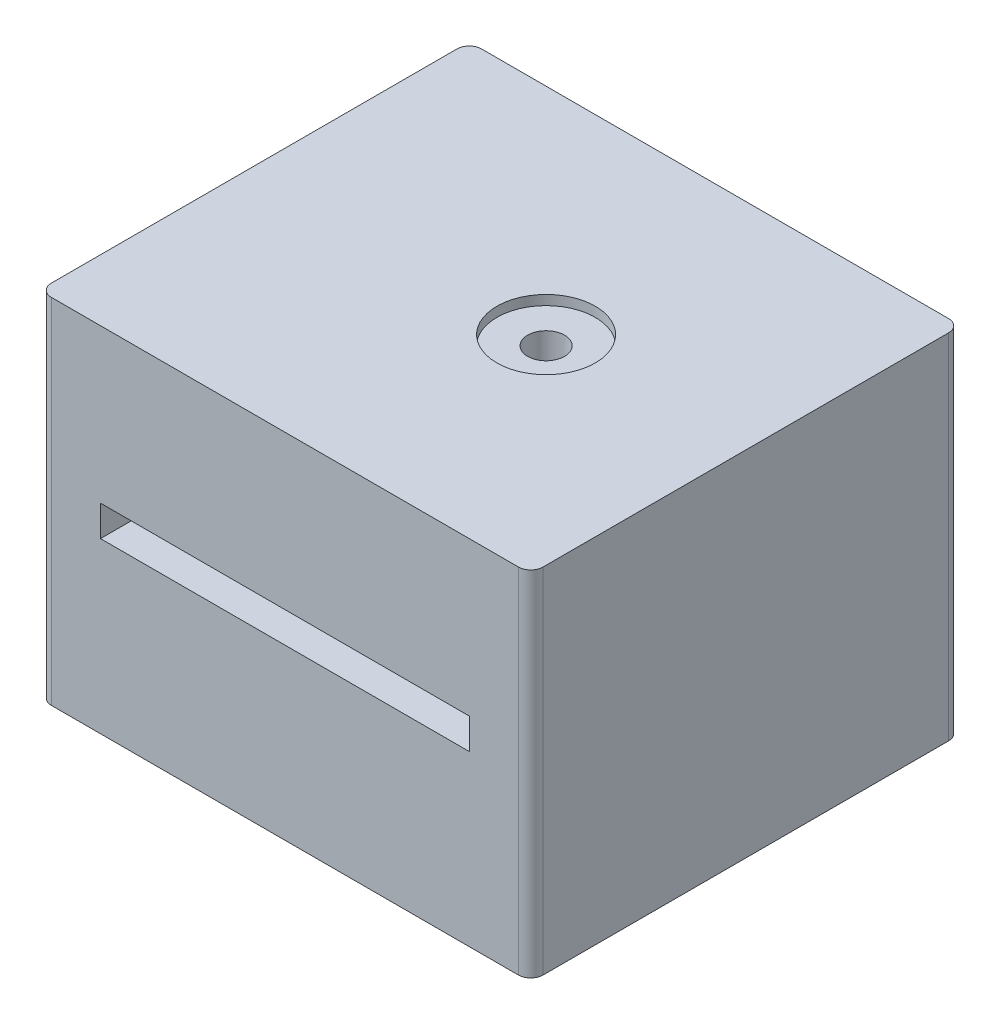
ISO-10303-21;
HEADER;
FILE_DESCRIPTION(('STEP AP214'),'2;1');
FILE_NAME('part.step','',(''),(''),'','','');
FILE_SCHEMA(('AUTOMOTIVE_DESIGN { 1 0 10303 214 1 1 1 1 }'));
ENDSEC;
DATA;
#1=APPLICATION_CONTEXT('core data for automotive mechanical design processes');
#2=APPLICATION_PROTOCOL_DEFINITION('international standard','automotive_design',2000,#1);
#3=PRODUCT_CONTEXT('',#1,'mechanical');
#4=PRODUCT('Part','Part','',(#3));
#5=PRODUCT_RELATED_PRODUCT_CATEGORY('part','',(#4));
#6=PRODUCT_DEFINITION_FORMATION('','',#4);
#7=PRODUCT_DEFINITION_CONTEXT('part definition',#1,'design');
#8=PRODUCT_DEFINITION('design','',#6,#7);
#9=PRODUCT_DEFINITION_SHAPE('','',#8);
#10=(LENGTH_UNIT() NAMED_UNIT(*) SI_UNIT(.MILLI.,.METRE.));
#11=(NAMED_UNIT(*) PLANE_ANGLE_UNIT() SI_UNIT($,.RADIAN.));
#12=(NAMED_UNIT(*) SI_UNIT($,.STERADIAN.) SOLID_ANGLE_UNIT());
#13=UNCERTAINTY_MEASURE_WITH_UNIT(LENGTH_MEASURE(1.E-05),#10,'distance_accuracy_value','');
#14=(GEOMETRIC_REPRESENTATION_CONTEXT(3) GLOBAL_UNCERTAINTY_ASSIGNED_CONTEXT((#13)) GLOBAL_UNIT_ASSIGNED_CONTEXT((#10,
#11,#12)) REPRESENTATION_CONTEXT('',''));
#15=CARTESIAN_POINT('',(0.,0.,0.));
#16=DIRECTION('',(0.,0.,1.));
#17=DIRECTION('',(1.,0.,0.));
#18=AXIS2_PLACEMENT_3D('',#15,#16,#17);
#19=CARTESIAN_POINT('',(-60.,40.,50.));
#20=DIRECTION('',(0.,0.,1.));
#21=DIRECTION('',(1.,0.,0.));
#22=AXIS2_PLACEMENT_3D('',#19,#20,#21);
#23=PLANE('',#22);
#24=DIRECTION('',(0.,1.,0.));
#25=VECTOR('',#24,1.);
#26=CARTESIAN_POINT('',(60.,40.,50.));
#27=LINE('',#26,#25);
#28=CARTESIAN_POINT('',(60.,50.,50.));
#29=VERTEX_POINT('',#28);
#30=CARTESIAN_POINT('',(60.,80.,50.));
#31=VERTEX_POINT('',#30);
#32=EDGE_CURVE('E147',#29,#31,#27,.T.);
#33=ORIENTED_EDGE('',*,*,#32,.F.);
#34=DIRECTION('',(-1.,0.,0.));
#35=VECTOR('',#34,1.);
#36=CARTESIAN_POINT('',(-60.,50.0000000000001,50.));
#37=LINE('',#36,#35);
#38=CARTESIAN_POINT('',(-60.,50.0000000000001,50.));
#39=VERTEX_POINT('',#38);
#40=EDGE_CURVE('E155',#29,#39,#37,.T.);
#41=ORIENTED_EDGE('',*,*,#40,.T.);
#42=DIRECTION('',(0.,1.,0.));
#43=VECTOR('',#42,1.);
#44=CARTESIAN_POINT('',(-60.,40.,50.));
#45=LINE('',#44,#43);
#46=CARTESIAN_POINT('',(-60.,80.,50.));
#47=VERTEX_POINT('',#46);
#48=EDGE_CURVE('E180',#39,#47,#45,.T.);
#49=ORIENTED_EDGE('',*,*,#48,.T.);
#50=DIRECTION('',(1.,0.,0.));
#51=VECTOR('',#50,1.);
#52=CARTESIAN_POINT('',(-60.,80.,50.));
#53=LINE('',#52,#51);
#54=EDGE_CURVE('E165',#47,#31,#53,.T.);
#55=ORIENTED_EDGE('',*,*,#54,.T.);
#56=EDGE_LOOP('',(#33,#41,#49,#55));
#57=FACE_BOUND('',#56,.T.);
#58=ADVANCED_FACE('F41',(#57),#23,.F.);
#59=CARTESIAN_POINT('',(-60.,40.,-50.));
#60=DIRECTION('',(-1.,0.,0.));
#61=DIRECTION('',(0.,0.,1.));
#62=AXIS2_PLACEMENT_3D('',#59,#60,#61);
#63=PLANE('',#62);
#64=DIRECTION('',(0.,0.,1.));
#65=VECTOR('',#64,1.);
#66=CARTESIAN_POINT('',(-60.,80.,-50.));
#67=LINE('',#66,#65);
#68=CARTESIAN_POINT('',(-60.,80.,-50.));
#69=VERTEX_POINT('',#68);
#70=EDGE_CURVE('E362',#69,#47,#67,.T.);
#71=ORIENTED_EDGE('',*,*,#70,.T.);
#72=ORIENTED_EDGE('',*,*,#48,.F.);
#73=DIRECTION('',(0.,0.,1.));
#74=VECTOR('',#73,1.);
#75=CARTESIAN_POINT('',(-60.,50.0000000000001,50.));
#76=LINE('',#75,#74);
#77=CARTESIAN_POINT('',(-60.,50.0000000000001,70.));
#78=VERTEX_POINT('',#77);
#79=EDGE_CURVE('E154',#39,#78,#76,.T.);
#80=ORIENTED_EDGE('',*,*,#79,.T.);
#81=DIRECTION('',(0.,-1.,0.));
#82=VECTOR('',#81,1.);
#83=CARTESIAN_POINT('',(-60.,50.0000000000001,70.));
#84=LINE('',#83,#82);
#85=CARTESIAN_POINT('',(-60.,40.,70.));
#86=VERTEX_POINT('',#85);
#87=EDGE_CURVE('E374',#78,#86,#84,.T.);
#88=ORIENTED_EDGE('',*,*,#87,.T.);
#89=DIRECTION('',(0.,0.,1.));
#90=VECTOR('',#89,1.);
#91=CARTESIAN_POINT('',(-60.,40.,-50.));
#92=LINE('',#91,#90);
#93=CARTESIAN_POINT('',(-60.,40.,-50.));
#94=VERTEX_POINT('',#93);
#95=EDGE_CURVE('E167',#94,#86,#92,.T.);
#96=ORIENTED_EDGE('',*,*,#95,.F.);
#97=DIRECTION('',(0.,1.,0.));
#98=VECTOR('',#97,1.);
#99=CARTESIAN_POINT('',(-60.,40.,-50.));
#100=LINE('',#99,#98);
#101=EDGE_CURVE('E170',#94,#69,#100,.T.);
#102=ORIENTED_EDGE('',*,*,#101,.T.);
#103=EDGE_LOOP('',(#71,#72,#80,#88,#96,#102));
#104=FACE_BOUND('',#103,.T.);
#105=ADVANCED_FACE('F278',(#104),#63,.F.);
#106=CARTESIAN_POINT('',(-60.,40.,-50.));
#107=DIRECTION('',(0.,0.,1.));
#108=DIRECTION('',(1.,0.,0.));
#109=AXIS2_PLACEMENT_3D('',#106,#107,#108);
#110=PLANE('',#109);
#111=DIRECTION('',(1.,0.,0.));
#112=VECTOR('',#111,1.);
#113=CARTESIAN_POINT('',(-60.,80.,-50.));
#114=LINE('',#113,#112);
#115=CARTESIAN_POINT('',(60.,80.,-50.));
#116=VERTEX_POINT('',#115);
#117=EDGE_CURVE('E357',#69,#116,#114,.T.);
#118=ORIENTED_EDGE('',*,*,#117,.F.);
#119=ORIENTED_EDGE('',*,*,#101,.F.);
#120=DIRECTION('',(1.,0.,0.));
#121=VECTOR('',#120,1.);
#122=CARTESIAN_POINT('',(-60.,40.,-50.));
#123=LINE('',#122,#121);
#124=CARTESIAN_POINT('',(60.,40.,-50.));
#125=VERTEX_POINT('',#124);
#126=EDGE_CURVE('E172',#94,#125,#123,.T.);
#127=ORIENTED_EDGE('',*,*,#126,.T.);
#128=DIRECTION('',(0.,1.,0.));
#129=VECTOR('',#128,1.);
#130=CARTESIAN_POINT('',(60.,40.,-50.));
#131=LINE('',#130,#129);
#132=EDGE_CURVE('E166',#125,#116,#131,.T.);
#133=ORIENTED_EDGE('',*,*,#132,.T.);
#134=EDGE_LOOP('',(#118,#119,#127,#133));
#135=FACE_BOUND('',#134,.T.);
#136=ADVANCED_FACE('F283',(#135),#110,.T.);
#137=CARTESIAN_POINT('',(60.,40.,-50.));
#138=DIRECTION('',(-1.,0.,0.));
#139=DIRECTION('',(0.,0.,1.));
#140=AXIS2_PLACEMENT_3D('',#137,#138,#139);
#141=PLANE('',#140);
#142=DIRECTION('',(0.,0.,1.));
#143=VECTOR('',#142,1.);
#144=CARTESIAN_POINT('',(60.,80.,-50.));
#145=LINE('',#144,#143);
#146=EDGE_CURVE('E363',#116,#31,#145,.T.);
#147=ORIENTED_EDGE('',*,*,#146,.F.);
#148=ORIENTED_EDGE('',*,*,#132,.F.);
#149=DIRECTION('',(0.,0.,1.));
#150=VECTOR('',#149,1.);
#151=CARTESIAN_POINT('',(60.,40.,-50.));
#152=LINE('',#151,#150);
#153=CARTESIAN_POINT('',(60.,40.,70.));
#154=VERTEX_POINT('',#153);
#155=EDGE_CURVE('E366',#125,#154,#152,.T.);
#156=ORIENTED_EDGE('',*,*,#155,.T.);
#157=DIRECTION('',(0.,1.,0.));
#158=VECTOR('',#157,1.);
#159=CARTESIAN_POINT('',(60.,50.,70.));
#160=LINE('',#159,#158);
#161=CARTESIAN_POINT('',(60.,50.,70.));
#162=VERTEX_POINT('',#161);
#163=EDGE_CURVE('E150',#154,#162,#160,.T.);
#164=ORIENTED_EDGE('',*,*,#163,.T.);
#165=DIRECTION('',(0.,0.,1.));
#166=VECTOR('',#165,1.);
#167=CARTESIAN_POINT('',(60.,50.,50.));
#168=LINE('',#167,#166);
#169=EDGE_CURVE('E142',#29,#162,#168,.T.);
#170=ORIENTED_EDGE('',*,*,#169,.F.);
#171=ORIENTED_EDGE('',*,*,#32,.T.);
#172=EDGE_LOOP('',(#147,#148,#156,#164,#170,#171));
#173=FACE_BOUND('',#172,.T.);
#174=ADVANCED_FACE('F145',(#173),#141,.T.);
#175=CARTESIAN_POINT('',(0.,40.,0.));
#176=DIRECTION('',(0.,-1.,0.));
#177=DIRECTION('',(0.,0.,-1.));
#178=AXIS2_PLACEMENT_3D('',#175,#176,#177);
#179=PLANE('',#178);
#180=CARTESIAN_POINT('',(-15.,40.,0.));
#181=DIRECTION('',(0.,1.,0.));
#182=DIRECTION('',(0.,0.,1.));
#183=AXIS2_PLACEMENT_3D('',#180,#181,#182);
#184=CIRCLE('',#183,16.);
#185=CARTESIAN_POINT('',(-15.,40.,16.));
#186=VERTEX_POINT('',#185);
#187=EDGE_CURVE('E395',#186,#186,#184,.T.);
#188=ORIENTED_EDGE('',*,*,#187,.F.);
#189=EDGE_LOOP('',(#188));
#190=FACE_BOUND('',#189,.T.);
#191=CARTESIAN_POINT('',(15.,40.,0.));
#192=DIRECTION('',(0.,1.,0.));
#193=DIRECTION('',(0.,0.,1.));
#194=AXIS2_PLACEMENT_3D('',#191,#192,#193);
#195=CIRCLE('',#194,8.);
#196=CARTESIAN_POINT('',(15.,40.,8.));
#197=VERTEX_POINT('',#196);
#198=EDGE_CURVE('E389',#197,#197,#195,.T.);
#199=ORIENTED_EDGE('',*,*,#198,.F.);
#200=EDGE_LOOP('',(#199));
#201=FACE_BOUND('',#200,.T.);
#202=ORIENTED_EDGE('',*,*,#95,.T.);
#203=DIRECTION('',(1.,0.,0.));
#204=VECTOR('',#203,1.);
#205=CARTESIAN_POINT('',(-60.,40.,70.));
#206=LINE('',#205,#204);
#207=EDGE_CURVE('E379',#86,#154,#206,.T.);
#208=ORIENTED_EDGE('',*,*,#207,.T.);
#209=ORIENTED_EDGE('',*,*,#155,.F.);
#210=ORIENTED_EDGE('',*,*,#126,.F.);
#211=EDGE_LOOP('',(#202,#208,#209,#210));
#212=FACE_BOUND('',#211,.T.);
#213=ADVANCED_FACE('F345',(#190,#201,#212),#179,.F.);
#214=CARTESIAN_POINT('',(0.,80.,0.));
#215=DIRECTION('',(0.,-1.,0.));
#216=DIRECTION('',(0.,0.,-1.));
#217=AXIS2_PLACEMENT_3D('',#214,#215,#216);
#218=PLANE('',#217);
#219=CARTESIAN_POINT('',(-15.,80.,0.));
#220=DIRECTION('',(0.,1.,0.));
#221=DIRECTION('',(0.,0.,1.));
#222=AXIS2_PLACEMENT_3D('',#219,#220,#221);
#223=CIRCLE('',#222,8.);
#224=CARTESIAN_POINT('',(-15.,80.,8.));
#225=VERTEX_POINT('',#224);
#226=EDGE_CURVE('E417',#225,#225,#223,.T.);
#227=ORIENTED_EDGE('',*,*,#226,.T.);
#228=EDGE_LOOP('',(#227));
#229=FACE_BOUND('',#228,.T.);
#230=CARTESIAN_POINT('',(15.,80.,0.));
#231=DIRECTION('',(0.,-1.,0.));
#232=DIRECTION('',(0.,0.,-1.));
#233=AXIS2_PLACEMENT_3D('',#230,#231,#232);
#234=CIRCLE('',#233,6.);
#235=CARTESIAN_POINT('',(15.,80.,6.));
#236=VERTEX_POINT('',#235);
#237=EDGE_CURVE('E414',#236,#236,#234,.F.);
#238=ORIENTED_EDGE('',*,*,#237,.T.);
#239=EDGE_LOOP('',(#238));
#240=FACE_BOUND('',#239,.T.);
#241=ORIENTED_EDGE('',*,*,#54,.F.);
#242=ORIENTED_EDGE('',*,*,#70,.F.);
#243=ORIENTED_EDGE('',*,*,#117,.T.);
#244=ORIENTED_EDGE('',*,*,#146,.T.);
#245=EDGE_LOOP('',(#241,#242,#243,#244));
#246=FACE_BOUND('',#245,.T.);
#247=ADVANCED_FACE('F330',(#229,#240,#246),#218,.T.);
#248=CARTESIAN_POINT('',(15.,30.,0.));
#249=DIRECTION('',(0.,1.,0.));
#250=DIRECTION('',(0.,0.,1.));
#251=AXIS2_PLACEMENT_3D('',#248,#249,#250);
#252=PLANE('',#251);
#253=CARTESIAN_POINT('',(15.,30.,0.));
#254=DIRECTION('',(0.,1.,0.));
#255=DIRECTION('',(0.,0.,1.));
#256=AXIS2_PLACEMENT_3D('',#253,#254,#255);
#257=CIRCLE('',#256,8.);
#258=CARTESIAN_POINT('',(15.,30.,8.));
#259=VERTEX_POINT('',#258);
#260=EDGE_CURVE('E392',#259,#259,#257,.T.);
#261=ORIENTED_EDGE('',*,*,#260,.T.);
#262=EDGE_LOOP('',(#261));
#263=FACE_BOUND('',#262,.T.);
#264=CARTESIAN_POINT('',(15.,30.,0.));
#265=DIRECTION('',(0.,1.,0.));
#266=DIRECTION('',(0.,0.,1.));
#267=AXIS2_PLACEMENT_3D('',#264,#265,#266);
#268=CIRCLE('',#267,6.);
#269=CARTESIAN_POINT('',(15.,30.,6.));
#270=VERTEX_POINT('',#269);
#271=EDGE_CURVE('E201',#270,#270,#268,.F.);
#272=ORIENTED_EDGE('',*,*,#271,.T.);
#273=EDGE_LOOP('',(#272));
#274=FACE_BOUND('',#273,.T.);
#275=ADVANCED_FACE('F327',(#263,#274),#252,.T.);
#276=CARTESIAN_POINT('',(15.,30.,0.));
#277=DIRECTION('',(0.,1.,0.));
#278=DIRECTION('',(0.,0.,1.));
#279=AXIS2_PLACEMENT_3D('',#276,#277,#278);
#280=CYLINDRICAL_SURFACE('',#279,8.);
#281=ORIENTED_EDGE('',*,*,#260,.F.);
#282=EDGE_LOOP('',(#281));
#283=FACE_BOUND('',#282,.T.);
#284=ORIENTED_EDGE('',*,*,#198,.T.);
#285=EDGE_LOOP('',(#284));
#286=FACE_BOUND('',#285,.T.);
#287=ADVANCED_FACE('F321',(#283,#286),#280,.F.);
#288=CARTESIAN_POINT('',(-15.,30.,0.));
#289=DIRECTION('',(0.,1.,0.));
#290=DIRECTION('',(0.,0.,1.));
#291=AXIS2_PLACEMENT_3D('',#288,#289,#290);
#292=PLANE('',#291);
#293=CARTESIAN_POINT('',(-15.,30.,0.));
#294=DIRECTION('',(0.,1.,0.));
#295=DIRECTION('',(0.,0.,1.));
#296=AXIS2_PLACEMENT_3D('',#293,#294,#295);
#297=CIRCLE('',#296,16.);
#298=CARTESIAN_POINT('',(-15.,30.,16.));
#299=VERTEX_POINT('',#298);
#300=EDGE_CURVE('E205',#299,#299,#297,.T.);
#301=ORIENTED_EDGE('',*,*,#300,.T.);
#302=EDGE_LOOP('',(#301));
#303=FACE_BOUND('',#302,.T.);
#304=CARTESIAN_POINT('',(-15.,30.,0.));
#305=DIRECTION('',(0.,1.,0.));
#306=DIRECTION('',(0.,0.,1.));
#307=AXIS2_PLACEMENT_3D('',#304,#305,#306);
#308=CIRCLE('',#307,6.);
#309=CARTESIAN_POINT('',(-15.,30.,6.));
#310=VERTEX_POINT('',#309);
#311=EDGE_CURVE('E204',#310,#310,#308,.F.);
#312=ORIENTED_EDGE('',*,*,#311,.T.);
#313=EDGE_LOOP('',(#312));
#314=FACE_BOUND('',#313,.T.);
#315=ADVANCED_FACE('F317',(#303,#314),#292,.T.);
#316=CARTESIAN_POINT('',(-15.,30.,0.));
#317=DIRECTION('',(0.,1.,0.));
#318=DIRECTION('',(0.,0.,1.));
#319=AXIS2_PLACEMENT_3D('',#316,#317,#318);
#320=CYLINDRICAL_SURFACE('',#319,16.);
#321=ORIENTED_EDGE('',*,*,#300,.F.);
#322=EDGE_LOOP('',(#321));
#323=FACE_BOUND('',#322,.T.);
#324=ORIENTED_EDGE('',*,*,#187,.T.);
#325=EDGE_LOOP('',(#324));
#326=FACE_BOUND('',#325,.T.);
#327=ADVANCED_FACE('F320',(#323,#326),#320,.F.);
#328=CARTESIAN_POINT('',(15.,0.,0.));
#329=DIRECTION('',(0.,1.,0.));
#330=DIRECTION('',(0.,0.,1.));
#331=AXIS2_PLACEMENT_3D('',#328,#329,#330);
#332=PLANE('',#331);
#333=CARTESIAN_POINT('',(15.,0.,0.));
#334=DIRECTION('',(0.,1.,0.));
#335=DIRECTION('',(0.,0.,1.));
#336=AXIS2_PLACEMENT_3D('',#333,#334,#335);
#337=CIRCLE('',#336,6.);
#338=CARTESIAN_POINT('',(15.,0.,6.));
#339=VERTEX_POINT('',#338);
#340=EDGE_CURVE('E383',#339,#339,#337,.T.);
#341=ORIENTED_EDGE('',*,*,#340,.T.);
#342=EDGE_LOOP('',(#341));
#343=FACE_BOUND('',#342,.T.);
#344=ADVANCED_FACE('F325',(#343),#332,.T.);
#345=CARTESIAN_POINT('',(15.,0.,0.));
#346=DIRECTION('',(0.,1.,0.));
#347=DIRECTION('',(0.,0.,1.));
#348=AXIS2_PLACEMENT_3D('',#345,#346,#347);
#349=CYLINDRICAL_SURFACE('',#348,6.);
#350=ORIENTED_EDGE('',*,*,#340,.F.);
#351=EDGE_LOOP('',(#350));
#352=FACE_BOUND('',#351,.T.);
#353=ORIENTED_EDGE('',*,*,#271,.F.);
#354=EDGE_LOOP('',(#353));
#355=FACE_BOUND('',#354,.T.);
#356=ADVANCED_FACE('F337',(#352,#355),#349,.F.);
#357=CARTESIAN_POINT('',(-15.,0.,0.));
#358=DIRECTION('',(0.,-1.,0.));
#359=DIRECTION('',(0.,0.,-1.));
#360=AXIS2_PLACEMENT_3D('',#357,#358,#359);
#361=PLANE('',#360);
#362=CARTESIAN_POINT('',(-15.,0.,0.));
#363=DIRECTION('',(0.,1.,0.));
#364=DIRECTION('',(0.,0.,-1.));
#365=AXIS2_PLACEMENT_3D('',#362,#363,#364);
#366=CIRCLE('',#365,6.);
#367=CARTESIAN_POINT('',(-15.,0.,-6.));
#368=VERTEX_POINT('',#367);
#369=EDGE_CURVE('E208',#368,#368,#366,.T.);
#370=ORIENTED_EDGE('',*,*,#369,.T.);
#371=EDGE_LOOP('',(#370));
#372=FACE_BOUND('',#371,.T.);
#373=ADVANCED_FACE('F311',(#372),#361,.F.);
#374=CARTESIAN_POINT('',(-15.,0.,0.));
#375=DIRECTION('',(0.,1.,0.));
#376=DIRECTION('',(0.,0.,1.));
#377=AXIS2_PLACEMENT_3D('',#374,#375,#376);
#378=CYLINDRICAL_SURFACE('',#377,6.);
#379=ORIENTED_EDGE('',*,*,#369,.F.);
#380=EDGE_LOOP('',(#379));
#381=FACE_BOUND('',#380,.T.);
#382=ORIENTED_EDGE('',*,*,#311,.F.);
#383=EDGE_LOOP('',(#382));
#384=FACE_BOUND('',#383,.T.);
#385=ADVANCED_FACE('F306',(#381,#384),#378,.F.);
#386=CARTESIAN_POINT('',(-60.,50.0000000000001,50.));
#387=DIRECTION('',(0.,1.,0.));
#388=DIRECTION('',(-1.,0.,0.));
#389=AXIS2_PLACEMENT_3D('',#386,#387,#388);
#390=PLANE('',#389);
#391=DIRECTION('',(-1.,0.,0.));
#392=VECTOR('',#391,1.);
#393=CARTESIAN_POINT('',(-60.,50.0000000000001,70.));
#394=LINE('',#393,#392);
#395=EDGE_CURVE('E161',#162,#78,#394,.T.);
#396=ORIENTED_EDGE('',*,*,#395,.T.);
#397=ORIENTED_EDGE('',*,*,#79,.F.);
#398=ORIENTED_EDGE('',*,*,#40,.F.);
#399=ORIENTED_EDGE('',*,*,#169,.T.);
#400=EDGE_LOOP('',(#396,#397,#398,#399));
#401=FACE_BOUND('',#400,.T.);
#402=ADVANCED_FACE('F158',(#401),#390,.F.);
#403=CARTESIAN_POINT('',(-80.,-15.,70.));
#404=DIRECTION('',(-1.,0.,0.));
#405=DIRECTION('',(0.,0.,1.));
#406=AXIS2_PLACEMENT_3D('',#403,#404,#405);
#407=PLANE('',#406);
#408=DIRECTION('',(0.,0.,1.));
#409=VECTOR('',#408,1.);
#410=CARTESIAN_POINT('',(-80.,100.,70.));
#411=LINE('',#410,#409);
#412=CARTESIAN_POINT('',(-80.,100.,-66.));
#413=VERTEX_POINT('',#412);
#414=CARTESIAN_POINT('',(-80.,100.,66.));
#415=VERTEX_POINT('',#414);
#416=EDGE_CURVE('E176',#413,#415,#411,.T.);
#417=ORIENTED_EDGE('',*,*,#416,.F.);
#418=DIRECTION('',(0.,1.,0.));
#419=VECTOR('',#418,1.);
#420=CARTESIAN_POINT('',(-80.,-15.,-66.));
#421=LINE('',#420,#419);
#422=CARTESIAN_POINT('',(-80.,-15.,-66.));
#423=VERTEX_POINT('',#422);
#424=EDGE_CURVE('E224',#413,#423,#421,.F.);
#425=ORIENTED_EDGE('',*,*,#424,.T.);
#426=DIRECTION('',(0.,0.,1.));
#427=VECTOR('',#426,1.);
#428=CARTESIAN_POINT('',(-80.,-15.,70.));
#429=LINE('',#428,#427);
#430=CARTESIAN_POINT('',(-80.,-15.,66.));
#431=VERTEX_POINT('',#430);
#432=EDGE_CURVE('E189',#423,#431,#429,.T.);
#433=ORIENTED_EDGE('',*,*,#432,.T.);
#434=DIRECTION('',(0.,1.,0.));
#435=VECTOR('',#434,1.);
#436=CARTESIAN_POINT('',(-80.,-15.,66.));
#437=LINE('',#436,#435);
#438=EDGE_CURVE('E221',#431,#415,#437,.T.);
#439=ORIENTED_EDGE('',*,*,#438,.T.);
#440=EDGE_LOOP('',(#417,#425,#433,#439));
#441=FACE_BOUND('',#440,.T.);
#442=ADVANCED_FACE('F258',(#441),#407,.T.);
#443=CARTESIAN_POINT('',(-80.,-15.,-70.));
#444=DIRECTION('',(0.,0.,-1.));
#445=DIRECTION('',(-1.,0.,0.));
#446=AXIS2_PLACEMENT_3D('',#443,#444,#445);
#447=PLANE('',#446);
#448=DIRECTION('',(-1.,0.,0.));
#449=VECTOR('',#448,1.);
#450=CARTESIAN_POINT('',(-80.,-15.,-70.));
#451=LINE('',#450,#449);
#452=CARTESIAN_POINT('',(76.,-15.,-70.));
#453=VERTEX_POINT('',#452);
#454=CARTESIAN_POINT('',(-76.,-15.,-70.));
#455=VERTEX_POINT('',#454);
#456=EDGE_CURVE('E197',#453,#455,#451,.T.);
#457=ORIENTED_EDGE('',*,*,#456,.T.);
#458=DIRECTION('',(0.,1.,0.));
#459=VECTOR('',#458,1.);
#460=CARTESIAN_POINT('',(-76.,-15.,-70.));
#461=LINE('',#460,#459);
#462=CARTESIAN_POINT('',(-76.,100.,-70.));
#463=VERTEX_POINT('',#462);
#464=EDGE_CURVE('E210',#455,#463,#461,.T.);
#465=ORIENTED_EDGE('',*,*,#464,.T.);
#466=DIRECTION('',(-1.,0.,0.));
#467=VECTOR('',#466,1.);
#468=CARTESIAN_POINT('',(-80.,100.,-70.));
#469=LINE('',#468,#467);
#470=CARTESIAN_POINT('',(76.,100.,-70.));
#471=VERTEX_POINT('',#470);
#472=EDGE_CURVE('E186',#471,#463,#469,.T.);
#473=ORIENTED_EDGE('',*,*,#472,.F.);
#474=DIRECTION('',(0.,1.,0.));
#475=VECTOR('',#474,1.);
#476=CARTESIAN_POINT('',(76.,-15.,-70.));
#477=LINE('',#476,#475);
#478=EDGE_CURVE('E200',#471,#453,#477,.F.);
#479=ORIENTED_EDGE('',*,*,#478,.T.);
#480=EDGE_LOOP('',(#457,#465,#473,#479));
#481=FACE_BOUND('',#480,.T.);
#482=ADVANCED_FACE('F265',(#481),#447,.T.);
#483=CARTESIAN_POINT('',(80.,-15.,70.));
#484=DIRECTION('',(1.,0.,0.));
#485=DIRECTION('',(0.,0.,-1.));
#486=AXIS2_PLACEMENT_3D('',#483,#484,#485);
#487=PLANE('',#486);
#488=DIRECTION('',(0.,0.,-1.));
#489=VECTOR('',#488,1.);
#490=CARTESIAN_POINT('',(80.,-15.,70.));
#491=LINE('',#490,#489);
#492=CARTESIAN_POINT('',(80.,-15.,66.));
#493=VERTEX_POINT('',#492);
#494=CARTESIAN_POINT('',(80.,-15.,-66.));
#495=VERTEX_POINT('',#494);
#496=EDGE_CURVE('E194',#493,#495,#491,.T.);
#497=ORIENTED_EDGE('',*,*,#496,.T.);
#498=DIRECTION('',(0.,1.,0.));
#499=VECTOR('',#498,1.);
#500=CARTESIAN_POINT('',(80.,-15.,-66.));
#501=LINE('',#500,#499);
#502=CARTESIAN_POINT('',(80.,100.,-66.));
#503=VERTEX_POINT('',#502);
#504=EDGE_CURVE('E235',#495,#503,#501,.T.);
#505=ORIENTED_EDGE('',*,*,#504,.T.);
#506=DIRECTION('',(0.,0.,-1.));
#507=VECTOR('',#506,1.);
#508=CARTESIAN_POINT('',(80.,100.,70.));
#509=LINE('',#508,#507);
#510=CARTESIAN_POINT('',(80.,100.,66.));
#511=VERTEX_POINT('',#510);
#512=EDGE_CURVE('E183',#511,#503,#509,.T.);
#513=ORIENTED_EDGE('',*,*,#512,.F.);
#514=DIRECTION('',(0.,1.,0.));
#515=VECTOR('',#514,1.);
#516=CARTESIAN_POINT('',(80.,-15.,66.));
#517=LINE('',#516,#515);
#518=EDGE_CURVE('E233',#511,#493,#517,.F.);
#519=ORIENTED_EDGE('',*,*,#518,.T.);
#520=EDGE_LOOP('',(#497,#505,#513,#519));
#521=FACE_BOUND('',#520,.T.);
#522=ADVANCED_FACE('F240',(#521),#487,.T.);
#523=CARTESIAN_POINT('',(-80.,-15.,70.));
#524=DIRECTION('',(0.,0.,1.));
#525=DIRECTION('',(1.,0.,0.));
#526=AXIS2_PLACEMENT_3D('',#523,#524,#525);
#527=PLANE('',#526);
#528=ORIENTED_EDGE('',*,*,#87,.F.);
#529=ORIENTED_EDGE('',*,*,#395,.F.);
#530=ORIENTED_EDGE('',*,*,#163,.F.);
#531=ORIENTED_EDGE('',*,*,#207,.F.);
#532=EDGE_LOOP('',(#528,#529,#530,#531));
#533=FACE_BOUND('',#532,.T.);
#534=DIRECTION('',(1.,0.,0.));
#535=VECTOR('',#534,1.);
#536=CARTESIAN_POINT('',(-80.,-15.,70.));
#537=LINE('',#536,#535);
#538=CARTESIAN_POINT('',(-76.,-15.,70.));
#539=VERTEX_POINT('',#538);
#540=CARTESIAN_POINT('',(76.,-15.,70.));
#541=VERTEX_POINT('',#540);
#542=EDGE_CURVE('E192',#539,#541,#537,.T.);
#543=ORIENTED_EDGE('',*,*,#542,.T.);
#544=DIRECTION('',(0.,1.,0.));
#545=VECTOR('',#544,1.);
#546=CARTESIAN_POINT('',(76.,-15.,70.));
#547=LINE('',#546,#545);
#548=CARTESIAN_POINT('',(76.,100.,70.));
#549=VERTEX_POINT('',#548);
#550=EDGE_CURVE('E11',#541,#549,#547,.T.);
#551=ORIENTED_EDGE('',*,*,#550,.T.);
#552=DIRECTION('',(1.,0.,0.));
#553=VECTOR('',#552,1.);
#554=CARTESIAN_POINT('',(-80.,100.,70.));
#555=LINE('',#554,#553);
#556=CARTESIAN_POINT('',(-76.,100.,70.));
#557=VERTEX_POINT('',#556);
#558=EDGE_CURVE('E179',#557,#549,#555,.T.);
#559=ORIENTED_EDGE('',*,*,#558,.F.);
#560=DIRECTION('',(0.,1.,0.));
#561=VECTOR('',#560,1.);
#562=CARTESIAN_POINT('',(-76.,-15.,70.));
#563=LINE('',#562,#561);
#564=EDGE_CURVE('E49',#557,#539,#563,.F.);
#565=ORIENTED_EDGE('',*,*,#564,.T.);
#566=EDGE_LOOP('',(#543,#551,#559,#565));
#567=FACE_BOUND('',#566,.T.);
#568=ADVANCED_FACE('F250',(#533,#567),#527,.T.);
#569=CARTESIAN_POINT('',(0.,-15.,0.));
#570=DIRECTION('',(0.,-1.,0.));
#571=DIRECTION('',(0.,0.,-1.));
#572=AXIS2_PLACEMENT_3D('',#569,#570,#571);
#573=PLANE('',#572);
#574=ORIENTED_EDGE('',*,*,#432,.F.);
#575=CARTESIAN_POINT('',(-76.,-15.,-66.));
#576=DIRECTION('',(0.,-1.,0.));
#577=DIRECTION('',(0.,0.,-1.));
#578=AXIS2_PLACEMENT_3D('',#575,#576,#577);
#579=CIRCLE('',#578,4.);
#580=EDGE_CURVE('E231',#423,#455,#579,.T.);
#581=ORIENTED_EDGE('',*,*,#580,.T.);
#582=ORIENTED_EDGE('',*,*,#456,.F.);
#583=CARTESIAN_POINT('',(76.,-15.,-66.));
#584=DIRECTION('',(0.,-1.,0.));
#585=DIRECTION('',(0.,0.,-1.));
#586=AXIS2_PLACEMENT_3D('',#583,#584,#585);
#587=CIRCLE('',#586,4.);
#588=EDGE_CURVE('E229',#453,#495,#587,.T.);
#589=ORIENTED_EDGE('',*,*,#588,.T.);
#590=ORIENTED_EDGE('',*,*,#496,.F.);
#591=CARTESIAN_POINT('',(76.,-15.,66.));
#592=DIRECTION('',(0.,-1.,0.));
#593=DIRECTION('',(0.,0.,-1.));
#594=AXIS2_PLACEMENT_3D('',#591,#592,#593);
#595=CIRCLE('',#594,4.);
#596=EDGE_CURVE('E56',#493,#541,#595,.T.);
#597=ORIENTED_EDGE('',*,*,#596,.T.);
#598=ORIENTED_EDGE('',*,*,#542,.F.);
#599=CARTESIAN_POINT('',(-76.,-15.,66.));
#600=DIRECTION('',(0.,-1.,0.));
#601=DIRECTION('',(0.,0.,-1.));
#602=AXIS2_PLACEMENT_3D('',#599,#600,#601);
#603=CIRCLE('',#602,4.);
#604=EDGE_CURVE('E226',#539,#431,#603,.T.);
#605=ORIENTED_EDGE('',*,*,#604,.T.);
#606=EDGE_LOOP('',(#574,#581,#582,#589,#590,#597,#598,#605));
#607=FACE_BOUND('',#606,.T.);
#608=ADVANCED_FACE('F253',(#607),#573,.T.);
#609=CARTESIAN_POINT('',(0.,100.,0.));
#610=DIRECTION('',(0.,-1.,0.));
#611=DIRECTION('',(0.,0.,-1.));
#612=AXIS2_PLACEMENT_3D('',#609,#610,#611);
#613=PLANE('',#612);
#614=CARTESIAN_POINT('',(15.,100.,0.));
#615=DIRECTION('',(0.,1.,0.));
#616=DIRECTION('',(0.,0.,1.));
#617=AXIS2_PLACEMENT_3D('',#614,#615,#616);
#618=CIRCLE('',#617,16.);
#619=CARTESIAN_POINT('',(15.,100.,16.));
#620=VERTEX_POINT('',#619);
#621=EDGE_CURVE('E406',#620,#620,#618,.T.);
#622=ORIENTED_EDGE('',*,*,#621,.F.);
#623=EDGE_LOOP('',(#622));
#624=FACE_BOUND('',#623,.T.);
#625=ORIENTED_EDGE('',*,*,#472,.T.);
#626=CARTESIAN_POINT('',(-76.,100.,-66.));
#627=DIRECTION('',(0.,-1.,0.));
#628=DIRECTION('',(0.,0.,-1.));
#629=AXIS2_PLACEMENT_3D('',#626,#627,#628);
#630=CIRCLE('',#629,4.);
#631=EDGE_CURVE('E219',#463,#413,#630,.F.);
#632=ORIENTED_EDGE('',*,*,#631,.T.);
#633=ORIENTED_EDGE('',*,*,#416,.T.);
#634=CARTESIAN_POINT('',(-76.,100.,66.));
#635=DIRECTION('',(0.,-1.,0.));
#636=DIRECTION('',(0.,0.,-1.));
#637=AXIS2_PLACEMENT_3D('',#634,#635,#636);
#638=CIRCLE('',#637,4.);
#639=EDGE_CURVE('E213',#415,#557,#638,.F.);
#640=ORIENTED_EDGE('',*,*,#639,.T.);
#641=ORIENTED_EDGE('',*,*,#558,.T.);
#642=CARTESIAN_POINT('',(76.,100.,66.));
#643=DIRECTION('',(0.,-1.,0.));
#644=DIRECTION('',(0.,0.,-1.));
#645=AXIS2_PLACEMENT_3D('',#642,#643,#644);
#646=CIRCLE('',#645,4.);
#647=EDGE_CURVE('E215',#549,#511,#646,.F.);
#648=ORIENTED_EDGE('',*,*,#647,.T.);
#649=ORIENTED_EDGE('',*,*,#512,.T.);
#650=CARTESIAN_POINT('',(76.,100.,-66.));
#651=DIRECTION('',(0.,-1.,0.));
#652=DIRECTION('',(0.,0.,-1.));
#653=AXIS2_PLACEMENT_3D('',#650,#651,#652);
#654=CIRCLE('',#653,4.);
#655=EDGE_CURVE('E217',#503,#471,#654,.F.);
#656=ORIENTED_EDGE('',*,*,#655,.T.);
#657=EDGE_LOOP('',(#625,#632,#633,#640,#641,#648,#649,#656));
#658=FACE_BOUND('',#657,.T.);
#659=ADVANCED_FACE('F245',(#624,#658),#613,.F.);
#660=CARTESIAN_POINT('',(15.,96.85,0.));
#661=DIRECTION('',(0.,1.,0.));
#662=DIRECTION('',(0.,0.,1.));
#663=AXIS2_PLACEMENT_3D('',#660,#661,#662);
#664=CYLINDRICAL_SURFACE('',#663,16.);
#665=CARTESIAN_POINT('',(15.,96.85,0.));
#666=DIRECTION('',(0.,1.,0.));
#667=DIRECTION('',(0.,0.,1.));
#668=AXIS2_PLACEMENT_3D('',#665,#666,#667);
#669=CIRCLE('',#668,16.);
#670=CARTESIAN_POINT('',(15.,96.85,16.));
#671=VERTEX_POINT('',#670);
#672=EDGE_CURVE('E404',#671,#671,#669,.T.);
#673=ORIENTED_EDGE('',*,*,#672,.F.);
#674=EDGE_LOOP('',(#673));
#675=FACE_BOUND('',#674,.T.);
#676=ORIENTED_EDGE('',*,*,#621,.T.);
#677=EDGE_LOOP('',(#676));
#678=FACE_BOUND('',#677,.T.);
#679=ADVANCED_FACE('F291',(#675,#678),#664,.F.);
#680=CARTESIAN_POINT('',(15.,96.85,0.));
#681=DIRECTION('',(0.,1.,0.));
#682=DIRECTION('',(0.,0.,1.));
#683=AXIS2_PLACEMENT_3D('',#680,#681,#682);
#684=PLANE('',#683);
#685=CARTESIAN_POINT('',(15.,96.85,0.));
#686=DIRECTION('',(0.,1.,0.));
#687=DIRECTION('',(0.,0.,1.));
#688=AXIS2_PLACEMENT_3D('',#685,#686,#687);
#689=CIRCLE('',#688,6.);
#690=CARTESIAN_POINT('',(15.,96.85,6.));
#691=VERTEX_POINT('',#690);
#692=EDGE_CURVE('E409',#691,#691,#689,.T.);
#693=ORIENTED_EDGE('',*,*,#692,.F.);
#694=EDGE_LOOP('',(#693));
#695=FACE_BOUND('',#694,.T.);
#696=ORIENTED_EDGE('',*,*,#672,.T.);
#697=EDGE_LOOP('',(#696));
#698=FACE_BOUND('',#697,.T.);
#699=ADVANCED_FACE('F438',(#695,#698),#684,.T.);
#700=CARTESIAN_POINT('',(15.,-15.001,0.));
#701=DIRECTION('',(0.,1.,0.));
#702=DIRECTION('',(0.,0.,1.));
#703=AXIS2_PLACEMENT_3D('',#700,#701,#702);
#704=CYLINDRICAL_SURFACE('',#703,6.);
#705=CARTESIAN_POINT('',(15.,80.,6.));
#706=CARTESIAN_POINT('',(15.,80.1755208333334,6.));
#707=CARTESIAN_POINT('',(15.,80.3510416666667,6.));
#708=CARTESIAN_POINT('',(15.,80.7020833333333,6.));
#709=CARTESIAN_POINT('',(15.,80.8776041666667,6.));
#710=CARTESIAN_POINT('',(15.,81.2286458333333,6.));
#711=CARTESIAN_POINT('',(15.,81.4041666666667,6.));
#712=CARTESIAN_POINT('',(15.,81.7552083333333,6.));
#713=CARTESIAN_POINT('',(15.,81.9307291666667,6.));
#714=CARTESIAN_POINT('',(15.,82.2817708333334,6.));
#715=CARTESIAN_POINT('',(15.,82.4572916666667,6.));
#716=CARTESIAN_POINT('',(15.,82.8083333333334,6.));
#717=CARTESIAN_POINT('',(15.,82.9838541666667,6.));
#718=CARTESIAN_POINT('',(15.,83.3348958333333,6.));
#719=CARTESIAN_POINT('',(15.,83.5104166666667,6.));
#720=CARTESIAN_POINT('',(15.,83.8614583333333,6.));
#721=CARTESIAN_POINT('',(15.,84.0369791666667,6.));
#722=CARTESIAN_POINT('',(15.,84.3880208333333,6.));
#723=CARTESIAN_POINT('',(15.,84.5635416666667,6.));
#724=CARTESIAN_POINT('',(15.,84.9145833333333,6.));
#725=CARTESIAN_POINT('',(15.,85.0901041666667,6.));
#726=CARTESIAN_POINT('',(15.,85.4411458333333,6.));
#727=CARTESIAN_POINT('',(15.,85.6166666666667,6.));
#728=CARTESIAN_POINT('',(15.,85.9677083333333,6.));
#729=CARTESIAN_POINT('',(15.,86.1432291666667,6.));
#730=CARTESIAN_POINT('',(15.,86.4942708333333,6.));
#731=CARTESIAN_POINT('',(15.,86.6697916666667,6.));
#732=CARTESIAN_POINT('',(15.,87.0208333333333,6.));
#733=CARTESIAN_POINT('',(15.,87.1963541666667,6.));
#734=CARTESIAN_POINT('',(15.,87.5473958333333,6.));
#735=CARTESIAN_POINT('',(15.,87.7229166666667,6.));
#736=CARTESIAN_POINT('',(15.,88.0739583333333,6.));
#737=CARTESIAN_POINT('',(15.,88.2494791666667,6.));
#738=CARTESIAN_POINT('',(15.,88.6005208333333,6.));
#739=CARTESIAN_POINT('',(15.,88.7760416666667,6.));
#740=CARTESIAN_POINT('',(15.,89.1270833333333,6.));
#741=CARTESIAN_POINT('',(15.,89.3026041666667,6.));
#742=CARTESIAN_POINT('',(15.,89.6536458333333,6.));
#743=CARTESIAN_POINT('',(15.,89.8291666666667,6.));
#744=CARTESIAN_POINT('',(15.,90.1802083333333,6.));
#745=CARTESIAN_POINT('',(15.,90.3557291666667,6.));
#746=CARTESIAN_POINT('',(15.,90.7067708333333,6.));
#747=CARTESIAN_POINT('',(15.,90.8822916666667,6.));
#748=CARTESIAN_POINT('',(15.,91.2333333333333,6.));
#749=CARTESIAN_POINT('',(15.,91.4088541666667,6.));
#750=CARTESIAN_POINT('',(15.,91.7598958333333,6.));
#751=CARTESIAN_POINT('',(15.,91.9354166666667,6.));
#752=CARTESIAN_POINT('',(15.,92.2864583333333,6.));
#753=CARTESIAN_POINT('',(15.,92.4619791666667,6.));
#754=CARTESIAN_POINT('',(15.,92.8130208333333,6.));
#755=CARTESIAN_POINT('',(15.,92.9885416666667,6.));
#756=CARTESIAN_POINT('',(15.,93.3395833333333,6.));
#757=CARTESIAN_POINT('',(15.,93.5151041666667,6.));
#758=CARTESIAN_POINT('',(15.,93.8661458333333,6.));
#759=CARTESIAN_POINT('',(15.,94.0416666666667,6.));
#760=CARTESIAN_POINT('',(15.,94.3927083333333,6.));
#761=CARTESIAN_POINT('',(15.,94.5682291666667,6.));
#762=CARTESIAN_POINT('',(15.,94.9192708333333,6.));
#763=CARTESIAN_POINT('',(15.,95.0947916666667,6.));
#764=CARTESIAN_POINT('',(15.,95.4458333333333,6.));
#765=CARTESIAN_POINT('',(15.,95.6213541666667,6.));
#766=CARTESIAN_POINT('',(15.,95.9723958333333,6.));
#767=CARTESIAN_POINT('',(15.,96.1479166666667,6.));
#768=CARTESIAN_POINT('',(15.,96.4989583333333,6.));
#769=CARTESIAN_POINT('',(15.,96.6744791666667,6.));
#770=CARTESIAN_POINT('',(15.,96.85,6.));
#771=B_SPLINE_CURVE_WITH_KNOTS('',3,(#705,#706,#707,#708,#709,#710,#711,#712,#713,#714,#715,
#716,#717,#718,#719,#720,#721,#722,#723,#724,#725,#726,#727,#728,#729,#730,#731,#732,#733,#734,
#735,#736,#737,#738,#739,#740,#741,#742,#743,#744,#745,#746,#747,#748,#749,#750,#751,#752,#753,
#754,#755,#756,#757,#758,#759,#760,#761,#762,#763,#764,#765,#766,#767,#768,#769,#770),
.UNSPECIFIED.,.F.,.F.,(4,2,2,2,2,2,2,2,2,2,2,2,2,2,2,2,2,2,2,2,2,2,2,2,2,2,2,2,2,2,2,2,4),(0.,
0.526562499999994,1.053125,1.5796875,2.10625,2.6328125,3.15937499999999,3.6859375,
4.21249999999999,4.73906249999999,5.265625,5.79218749999999,6.31874999999998,6.84531249999999,
7.37187499999999,7.89843749999999,8.42499999999999,8.95156249999998,9.47812499999999,10.0046875,
10.53125,11.0578125,11.584375,12.1109375,12.6375,13.1640625,13.690625,14.2171875,14.74375,
15.2703125,15.796875,16.3234375,16.85),.UNSPECIFIED.);
#772=EDGE_CURVE('BSEAM428',#236,#691,#771,.T.);
#773=ORIENTED_EDGE('',*,*,#237,.F.);
#774=ORIENTED_EDGE('',*,*,#692,.T.);
#775=ORIENTED_EDGE('',*,*,#772,.T.);
#776=ORIENTED_EDGE('',*,*,#772,.F.);
#777=EDGE_LOOP('',(#773,#775,#774,#776));
#778=FACE_BOUND('',#777,.T.);
#779=ADVANCED_FACE('F428',(#778),#704,.F.);
#780=CARTESIAN_POINT('',(-15.,80.,0.));
#781=DIRECTION('',(0.,1.,0.));
#782=DIRECTION('',(0.,0.,1.));
#783=AXIS2_PLACEMENT_3D('',#780,#781,#782);
#784=CYLINDRICAL_SURFACE('',#783,8.);
#785=ORIENTED_EDGE('',*,*,#226,.F.);
#786=EDGE_LOOP('',(#785));
#787=FACE_BOUND('',#786,.T.);
#788=CARTESIAN_POINT('',(-15.,90.,0.));
#789=DIRECTION('',(0.,1.,0.));
#790=DIRECTION('',(0.,0.,1.));
#791=AXIS2_PLACEMENT_3D('',#788,#789,#790);
#792=CIRCLE('',#791,8.);
#793=CARTESIAN_POINT('',(-15.,90.,8.));
#794=VERTEX_POINT('',#793);
#795=EDGE_CURVE('E418',#794,#794,#792,.T.);
#796=ORIENTED_EDGE('',*,*,#795,.T.);
#797=EDGE_LOOP('',(#796));
#798=FACE_BOUND('',#797,.T.);
#799=ADVANCED_FACE('F425',(#787,#798),#784,.F.);
#800=CARTESIAN_POINT('',(-15.,90.,0.));
#801=DIRECTION('',(0.,1.,0.));
#802=DIRECTION('',(0.,0.,1.));
#803=AXIS2_PLACEMENT_3D('',#800,#801,#802);
#804=PLANE('',#803);
#805=ORIENTED_EDGE('',*,*,#795,.F.);
#806=EDGE_LOOP('',(#805));
#807=FACE_BOUND('',#806,.T.);
#808=ADVANCED_FACE('F275',(#807),#804,.F.);
#809=CARTESIAN_POINT('',(-76.,-15.,-66.));
#810=DIRECTION('',(0.,1.,0.));
#811=DIRECTION('',(0.,0.,1.));
#812=AXIS2_PLACEMENT_3D('',#809,#810,#811);
#813=CYLINDRICAL_SURFACE('',#812,4.);
#814=ORIENTED_EDGE('',*,*,#580,.F.);
#815=ORIENTED_EDGE('',*,*,#424,.F.);
#816=ORIENTED_EDGE('',*,*,#631,.F.);
#817=ORIENTED_EDGE('',*,*,#464,.F.);
#818=EDGE_LOOP('',(#814,#815,#816,#817));
#819=FACE_BOUND('',#818,.T.);
#820=ADVANCED_FACE('F263',(#819),#813,.T.);
#821=CARTESIAN_POINT('',(76.,-15.,-66.));
#822=DIRECTION('',(0.,1.,0.));
#823=DIRECTION('',(0.,0.,1.));
#824=AXIS2_PLACEMENT_3D('',#821,#822,#823);
#825=CYLINDRICAL_SURFACE('',#824,4.);
#826=ORIENTED_EDGE('',*,*,#588,.F.);
#827=ORIENTED_EDGE('',*,*,#478,.F.);
#828=ORIENTED_EDGE('',*,*,#655,.F.);
#829=ORIENTED_EDGE('',*,*,#504,.F.);
#830=EDGE_LOOP('',(#826,#827,#828,#829));
#831=FACE_BOUND('',#830,.T.);
#832=ADVANCED_FACE('F268',(#831),#825,.T.);
#833=CARTESIAN_POINT('',(76.,-15.,66.));
#834=DIRECTION('',(0.,1.,0.));
#835=DIRECTION('',(0.,0.,1.));
#836=AXIS2_PLACEMENT_3D('',#833,#834,#835);
#837=CYLINDRICAL_SURFACE('',#836,4.);
#838=ORIENTED_EDGE('',*,*,#596,.F.);
#839=ORIENTED_EDGE('',*,*,#518,.F.);
#840=ORIENTED_EDGE('',*,*,#647,.F.);
#841=ORIENTED_EDGE('',*,*,#550,.F.);
#842=EDGE_LOOP('',(#838,#839,#840,#841));
#843=FACE_BOUND('',#842,.T.);
#844=ADVANCED_FACE('F249',(#843),#837,.T.);
#845=CARTESIAN_POINT('',(-76.,-15.,66.));
#846=DIRECTION('',(0.,1.,0.));
#847=DIRECTION('',(0.,0.,1.));
#848=AXIS2_PLACEMENT_3D('',#845,#846,#847);
#849=CYLINDRICAL_SURFACE('',#848,4.);
#850=ORIENTED_EDGE('',*,*,#604,.F.);
#851=ORIENTED_EDGE('',*,*,#564,.F.);
#852=ORIENTED_EDGE('',*,*,#639,.F.);
#853=ORIENTED_EDGE('',*,*,#438,.F.);
#854=EDGE_LOOP('',(#850,#851,#852,#853));
#855=FACE_BOUND('',#854,.T.);
#856=ADVANCED_FACE('F43',(#855),#849,.T.);
#857=CLOSED_SHELL('',(#58,#105,#136,#174,#213,#247,#275,#287,#315,#327,#344,#356,#373,#385,#402,
#442,#482,#522,#568,#608,#659,#679,#699,#779,#799,#808,#820,#832,#844,#856));
#858=MANIFOLD_SOLID_BREP('B2',#857);
#859=ADVANCED_BREP_SHAPE_REPRESENTATION('',(#18,#858),#14);
#860=SHAPE_DEFINITION_REPRESENTATION(#9,#859);
ENDSEC;
END-ISO-10303-21;
